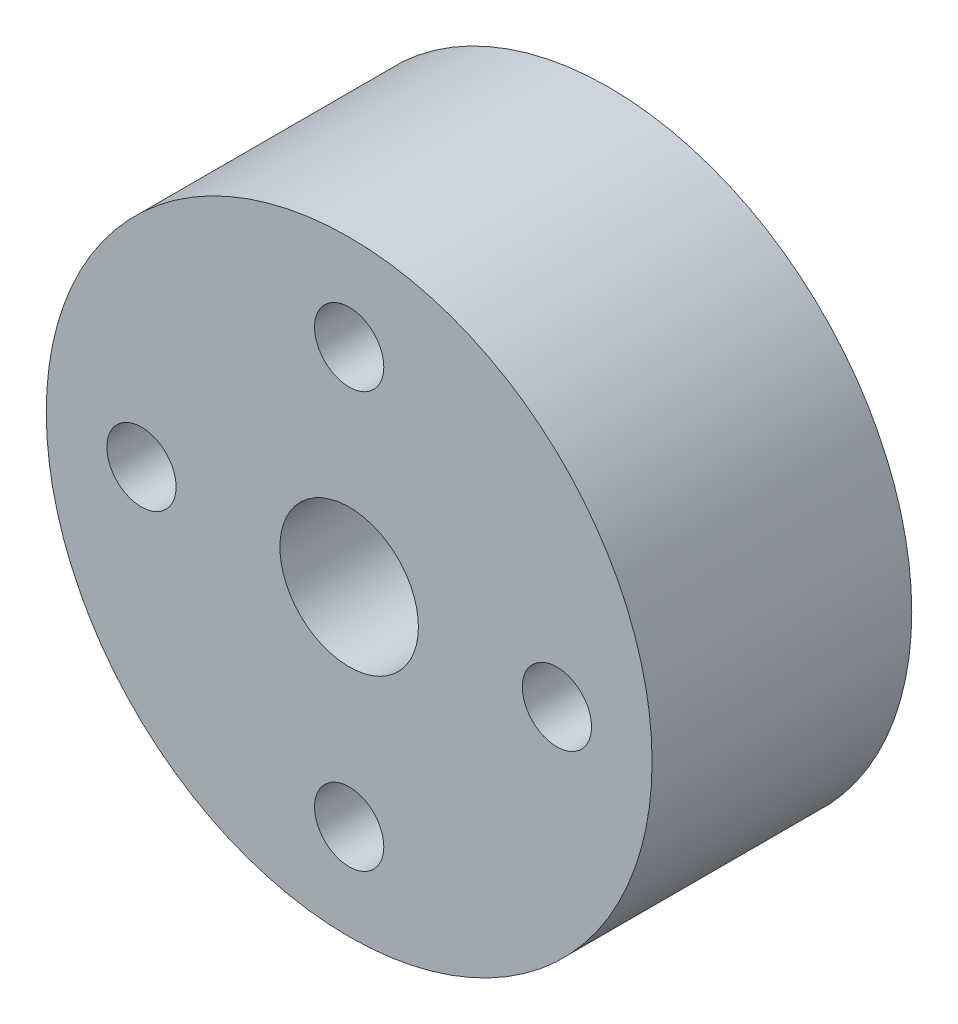
ISO-10303-21;
HEADER;
FILE_DESCRIPTION(('STEP AP214'),'2;1');
FILE_NAME('part.step','',(''),(''),'','','');
FILE_SCHEMA(('AUTOMOTIVE_DESIGN { 1 0 10303 214 1 1 1 1 }'));
ENDSEC;
DATA;
#1=APPLICATION_CONTEXT('core data for automotive mechanical design processes');
#2=APPLICATION_PROTOCOL_DEFINITION('international standard','automotive_design',2000,#1);
#3=PRODUCT_CONTEXT('',#1,'mechanical');
#4=PRODUCT('Part','Part','',(#3));
#5=PRODUCT_RELATED_PRODUCT_CATEGORY('part','',(#4));
#6=PRODUCT_DEFINITION_FORMATION('','',#4);
#7=PRODUCT_DEFINITION_CONTEXT('part definition',#1,'design');
#8=PRODUCT_DEFINITION('design','',#6,#7);
#9=PRODUCT_DEFINITION_SHAPE('','',#8);
#10=(LENGTH_UNIT() NAMED_UNIT(*) SI_UNIT(.MILLI.,.METRE.));
#11=(NAMED_UNIT(*) PLANE_ANGLE_UNIT() SI_UNIT($,.RADIAN.));
#12=(NAMED_UNIT(*) SI_UNIT($,.STERADIAN.) SOLID_ANGLE_UNIT());
#13=UNCERTAINTY_MEASURE_WITH_UNIT(LENGTH_MEASURE(1.E-05),#10,'distance_accuracy_value','');
#14=(GEOMETRIC_REPRESENTATION_CONTEXT(3) GLOBAL_UNCERTAINTY_ASSIGNED_CONTEXT((#13)) GLOBAL_UNIT_ASSIGNED_CONTEXT((#10,
#11,#12)) REPRESENTATION_CONTEXT('',''));
#15=CARTESIAN_POINT('',(0.,0.,0.));
#16=DIRECTION('',(0.,0.,1.));
#17=DIRECTION('',(1.,0.,0.));
#18=AXIS2_PLACEMENT_3D('',#15,#16,#17);
#19=CARTESIAN_POINT('',(0.,0.,15.));
#20=DIRECTION('',(0.,0.,1.));
#21=DIRECTION('',(1.,0.,0.));
#22=AXIS2_PLACEMENT_3D('',#19,#20,#21);
#23=PLANE('',#22);
#24=CARTESIAN_POINT('',(-12.,0.,15.));
#25=DIRECTION('',(0.,0.,1.));
#26=DIRECTION('',(1.,0.,0.));
#27=AXIS2_PLACEMENT_3D('',#24,#25,#26);
#28=CIRCLE('',#27,2.);
#29=CARTESIAN_POINT('',(-10.,0.,15.));
#30=VERTEX_POINT('',#29);
#31=EDGE_CURVE('E65',#30,#30,#28,.T.);
#32=ORIENTED_EDGE('',*,*,#31,.F.);
#33=EDGE_LOOP('',(#32));
#34=FACE_BOUND('',#33,.T.);
#35=CARTESIAN_POINT('',(12.,0.,15.));
#36=DIRECTION('',(0.,0.,1.));
#37=DIRECTION('',(1.,0.,0.));
#38=AXIS2_PLACEMENT_3D('',#35,#36,#37);
#39=CIRCLE('',#38,2.);
#40=CARTESIAN_POINT('',(14.,0.,15.));
#41=VERTEX_POINT('',#40);
#42=EDGE_CURVE('E53',#41,#41,#39,.T.);
#43=ORIENTED_EDGE('',*,*,#42,.F.);
#44=EDGE_LOOP('',(#43));
#45=FACE_BOUND('',#44,.T.);
#46=CARTESIAN_POINT('',(0.,0.,15.));
#47=DIRECTION('',(0.,0.,1.));
#48=DIRECTION('',(1.,0.,0.));
#49=AXIS2_PLACEMENT_3D('',#46,#47,#48);
#50=CIRCLE('',#49,17.5);
#51=CARTESIAN_POINT('',(17.5,0.,15.));
#52=VERTEX_POINT('',#51);
#53=EDGE_CURVE('E10',#52,#52,#50,.T.);
#54=ORIENTED_EDGE('',*,*,#53,.T.);
#55=EDGE_LOOP('',(#54));
#56=FACE_BOUND('',#55,.T.);
#57=CARTESIAN_POINT('',(0.,0.,15.));
#58=DIRECTION('',(0.,0.,1.));
#59=DIRECTION('',(1.,0.,0.));
#60=AXIS2_PLACEMENT_3D('',#57,#58,#59);
#61=CIRCLE('',#60,4.);
#62=CARTESIAN_POINT('',(4.,0.,15.));
#63=VERTEX_POINT('',#62);
#64=EDGE_CURVE('E48',#63,#63,#61,.T.);
#65=ORIENTED_EDGE('',*,*,#64,.F.);
#66=EDGE_LOOP('',(#65));
#67=FACE_BOUND('',#66,.T.);
#68=CARTESIAN_POINT('',(0.,-12.,15.));
#69=DIRECTION('',(0.,0.,1.));
#70=DIRECTION('',(1.,0.,0.));
#71=AXIS2_PLACEMENT_3D('',#68,#69,#70);
#72=CIRCLE('',#71,2.);
#73=CARTESIAN_POINT('',(1.99999999999996,-12.,15.));
#74=VERTEX_POINT('',#73);
#75=EDGE_CURVE('E59',#74,#74,#72,.T.);
#76=ORIENTED_EDGE('',*,*,#75,.F.);
#77=EDGE_LOOP('',(#76));
#78=FACE_BOUND('',#77,.T.);
#79=CARTESIAN_POINT('',(1.25693328198353E-13,12.,15.));
#80=DIRECTION('',(0.,0.,1.));
#81=DIRECTION('',(1.,0.,0.));
#82=AXIS2_PLACEMENT_3D('',#79,#80,#81);
#83=CIRCLE('',#82,2.);
#84=CARTESIAN_POINT('',(2.00000000000013,12.,15.));
#85=VERTEX_POINT('',#84);
#86=EDGE_CURVE('E71',#85,#85,#83,.T.);
#87=ORIENTED_EDGE('',*,*,#86,.F.);
#88=EDGE_LOOP('',(#87));
#89=FACE_BOUND('',#88,.T.);
#90=ADVANCED_FACE('F37',(#34,#45,#56,#67,#78,#89),#23,.T.);
#91=CARTESIAN_POINT('',(0.,0.,0.));
#92=DIRECTION('',(0.,0.,1.));
#93=DIRECTION('',(1.,0.,0.));
#94=AXIS2_PLACEMENT_3D('',#91,#92,#93);
#95=PLANE('',#94);
#96=CARTESIAN_POINT('',(0.,0.,0.));
#97=DIRECTION('',(0.,0.,1.));
#98=DIRECTION('',(1.,0.,0.));
#99=AXIS2_PLACEMENT_3D('',#96,#97,#98);
#100=CIRCLE('',#99,17.5);
#101=CARTESIAN_POINT('',(17.5,0.,0.));
#102=VERTEX_POINT('',#101);
#103=EDGE_CURVE('E41',#102,#102,#100,.T.);
#104=ORIENTED_EDGE('',*,*,#103,.F.);
#105=EDGE_LOOP('',(#104));
#106=FACE_BOUND('',#105,.T.);
#107=CARTESIAN_POINT('',(0.,0.,0.));
#108=DIRECTION('',(0.,0.,1.));
#109=DIRECTION('',(1.,0.,0.));
#110=AXIS2_PLACEMENT_3D('',#107,#108,#109);
#111=CIRCLE('',#110,4.);
#112=CARTESIAN_POINT('',(4.,0.,0.));
#113=VERTEX_POINT('',#112);
#114=EDGE_CURVE('E50',#113,#113,#111,.T.);
#115=ORIENTED_EDGE('',*,*,#114,.T.);
#116=EDGE_LOOP('',(#115));
#117=FACE_BOUND('',#116,.T.);
#118=CARTESIAN_POINT('',(12.,0.,0.));
#119=DIRECTION('',(0.,0.,1.));
#120=DIRECTION('',(1.,0.,0.));
#121=AXIS2_PLACEMENT_3D('',#118,#119,#120);
#122=CIRCLE('',#121,2.);
#123=CARTESIAN_POINT('',(14.,0.,0.));
#124=VERTEX_POINT('',#123);
#125=EDGE_CURVE('E56',#124,#124,#122,.T.);
#126=ORIENTED_EDGE('',*,*,#125,.T.);
#127=EDGE_LOOP('',(#126));
#128=FACE_BOUND('',#127,.T.);
#129=CARTESIAN_POINT('',(0.,-12.,0.));
#130=DIRECTION('',(0.,0.,1.));
#131=DIRECTION('',(1.,0.,0.));
#132=AXIS2_PLACEMENT_3D('',#129,#130,#131);
#133=CIRCLE('',#132,2.);
#134=CARTESIAN_POINT('',(1.99999999999996,-12.,0.));
#135=VERTEX_POINT('',#134);
#136=EDGE_CURVE('E62',#135,#135,#133,.T.);
#137=ORIENTED_EDGE('',*,*,#136,.T.);
#138=EDGE_LOOP('',(#137));
#139=FACE_BOUND('',#138,.T.);
#140=CARTESIAN_POINT('',(-12.,0.,0.));
#141=DIRECTION('',(0.,0.,1.));
#142=DIRECTION('',(1.,0.,0.));
#143=AXIS2_PLACEMENT_3D('',#140,#141,#142);
#144=CIRCLE('',#143,2.);
#145=CARTESIAN_POINT('',(-10.,0.,0.));
#146=VERTEX_POINT('',#145);
#147=EDGE_CURVE('E68',#146,#146,#144,.T.);
#148=ORIENTED_EDGE('',*,*,#147,.T.);
#149=EDGE_LOOP('',(#148));
#150=FACE_BOUND('',#149,.T.);
#151=CARTESIAN_POINT('',(1.25693328198353E-13,12.,0.));
#152=DIRECTION('',(0.,0.,1.));
#153=DIRECTION('',(1.,0.,0.));
#154=AXIS2_PLACEMENT_3D('',#151,#152,#153);
#155=CIRCLE('',#154,2.);
#156=CARTESIAN_POINT('',(2.00000000000013,12.,0.));
#157=VERTEX_POINT('',#156);
#158=EDGE_CURVE('E74',#157,#157,#155,.T.);
#159=ORIENTED_EDGE('',*,*,#158,.T.);
#160=EDGE_LOOP('',(#159));
#161=FACE_BOUND('',#160,.T.);
#162=ADVANCED_FACE('F84',(#106,#117,#128,#139,#150,#161),#95,.F.);
#163=CARTESIAN_POINT('',(0.,0.,15.));
#164=DIRECTION('',(0.,0.,-1.));
#165=DIRECTION('',(-1.,0.,0.));
#166=AXIS2_PLACEMENT_3D('',#163,#164,#165);
#167=CYLINDRICAL_SURFACE('',#166,17.5);
#168=ORIENTED_EDGE('',*,*,#53,.F.);
#169=EDGE_LOOP('',(#168));
#170=FACE_BOUND('',#169,.T.);
#171=ORIENTED_EDGE('',*,*,#103,.T.);
#172=EDGE_LOOP('',(#171));
#173=FACE_BOUND('',#172,.T.);
#174=ADVANCED_FACE('F39',(#170,#173),#167,.T.);
#175=CARTESIAN_POINT('',(0.,0.,15.));
#176=DIRECTION('',(0.,0.,-1.));
#177=DIRECTION('',(-1.,0.,0.));
#178=AXIS2_PLACEMENT_3D('',#175,#176,#177);
#179=CYLINDRICAL_SURFACE('',#178,4.);
#180=ORIENTED_EDGE('',*,*,#64,.T.);
#181=EDGE_LOOP('',(#180));
#182=FACE_BOUND('',#181,.T.);
#183=ORIENTED_EDGE('',*,*,#114,.F.);
#184=EDGE_LOOP('',(#183));
#185=FACE_BOUND('',#184,.T.);
#186=ADVANCED_FACE('F94',(#182,#185),#179,.F.);
#187=CARTESIAN_POINT('',(12.,0.,15.));
#188=DIRECTION('',(0.,0.,-1.));
#189=DIRECTION('',(-1.,0.,0.));
#190=AXIS2_PLACEMENT_3D('',#187,#188,#189);
#191=CYLINDRICAL_SURFACE('',#190,2.);
#192=ORIENTED_EDGE('',*,*,#42,.T.);
#193=EDGE_LOOP('',(#192));
#194=FACE_BOUND('',#193,.T.);
#195=ORIENTED_EDGE('',*,*,#125,.F.);
#196=EDGE_LOOP('',(#195));
#197=FACE_BOUND('',#196,.T.);
#198=ADVANCED_FACE('F97',(#194,#197),#191,.F.);
#199=CARTESIAN_POINT('',(0.,-12.,15.));
#200=DIRECTION('',(0.,0.,-1.));
#201=DIRECTION('',(-1.,0.,0.));
#202=AXIS2_PLACEMENT_3D('',#199,#200,#201);
#203=CYLINDRICAL_SURFACE('',#202,2.);
#204=ORIENTED_EDGE('',*,*,#75,.T.);
#205=EDGE_LOOP('',(#204));
#206=FACE_BOUND('',#205,.T.);
#207=ORIENTED_EDGE('',*,*,#136,.F.);
#208=EDGE_LOOP('',(#207));
#209=FACE_BOUND('',#208,.T.);
#210=ADVANCED_FACE('F101',(#206,#209),#203,.F.);
#211=CARTESIAN_POINT('',(-12.,0.,15.));
#212=DIRECTION('',(0.,0.,-1.));
#213=DIRECTION('',(-1.,0.,0.));
#214=AXIS2_PLACEMENT_3D('',#211,#212,#213);
#215=CYLINDRICAL_SURFACE('',#214,2.);
#216=ORIENTED_EDGE('',*,*,#31,.T.);
#217=EDGE_LOOP('',(#216));
#218=FACE_BOUND('',#217,.T.);
#219=ORIENTED_EDGE('',*,*,#147,.F.);
#220=EDGE_LOOP('',(#219));
#221=FACE_BOUND('',#220,.T.);
#222=ADVANCED_FACE('F105',(#218,#221),#215,.F.);
#223=CARTESIAN_POINT('',(1.25693328198353E-13,12.,15.));
#224=DIRECTION('',(0.,0.,-1.));
#225=DIRECTION('',(-1.,0.,0.));
#226=AXIS2_PLACEMENT_3D('',#223,#224,#225);
#227=CYLINDRICAL_SURFACE('',#226,2.);
#228=ORIENTED_EDGE('',*,*,#86,.T.);
#229=EDGE_LOOP('',(#228));
#230=FACE_BOUND('',#229,.T.);
#231=ORIENTED_EDGE('',*,*,#158,.F.);
#232=EDGE_LOOP('',(#231));
#233=FACE_BOUND('',#232,.T.);
#234=ADVANCED_FACE('F80',(#230,#233),#227,.F.);
#235=CLOSED_SHELL('',(#90,#162,#174,#186,#198,#210,#222,#234));
#236=MANIFOLD_SOLID_BREP('B2',#235);
#237=ADVANCED_BREP_SHAPE_REPRESENTATION('',(#18,#236),#14);
#238=SHAPE_DEFINITION_REPRESENTATION(#9,#237);
ENDSEC;
END-ISO-10303-21;
